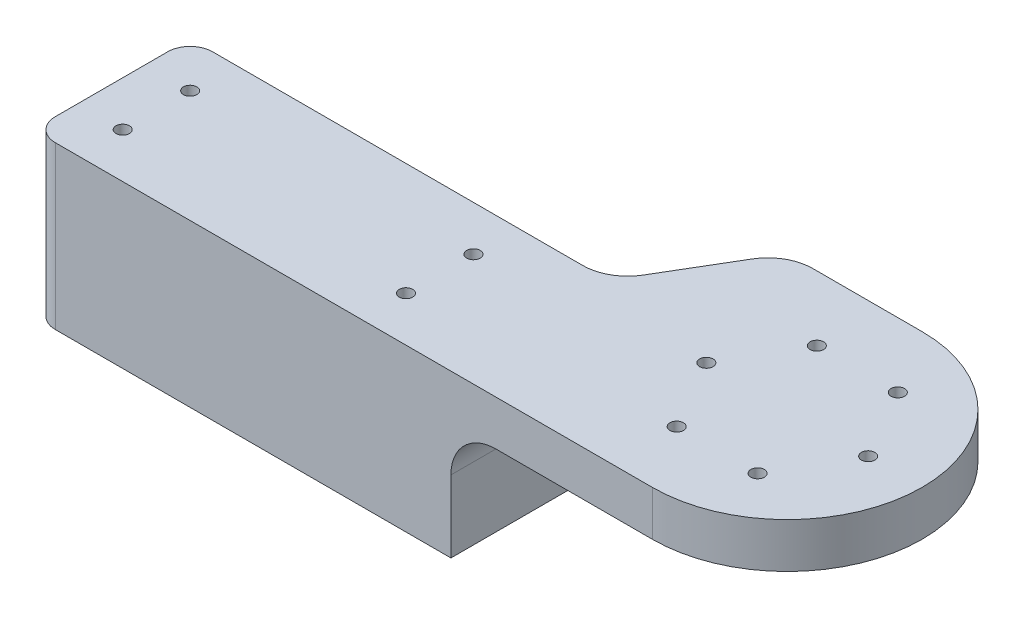
ISO-10303-21;
HEADER;
FILE_DESCRIPTION(('STEP AP214'),'2;1');
FILE_NAME('part.step','',(''),(''),'','','');
FILE_SCHEMA(('AUTOMOTIVE_DESIGN { 1 0 10303 214 1 1 1 1 }'));
ENDSEC;
DATA;
#1=APPLICATION_CONTEXT('core data for automotive mechanical design processes');
#2=APPLICATION_PROTOCOL_DEFINITION('international standard','automotive_design',2000,#1);
#3=PRODUCT_CONTEXT('',#1,'mechanical');
#4=PRODUCT('Part','Part','',(#3));
#5=PRODUCT_RELATED_PRODUCT_CATEGORY('part','',(#4));
#6=PRODUCT_DEFINITION_FORMATION('','',#4);
#7=PRODUCT_DEFINITION_CONTEXT('part definition',#1,'design');
#8=PRODUCT_DEFINITION('design','',#6,#7);
#9=PRODUCT_DEFINITION_SHAPE('','',#8);
#10=(LENGTH_UNIT() NAMED_UNIT(*) SI_UNIT(.MILLI.,.METRE.));
#11=(NAMED_UNIT(*) PLANE_ANGLE_UNIT() SI_UNIT($,.RADIAN.));
#12=(NAMED_UNIT(*) SI_UNIT($,.STERADIAN.) SOLID_ANGLE_UNIT());
#13=UNCERTAINTY_MEASURE_WITH_UNIT(LENGTH_MEASURE(1.E-05),#10,'distance_accuracy_value','');
#14=(GEOMETRIC_REPRESENTATION_CONTEXT(3) GLOBAL_UNCERTAINTY_ASSIGNED_CONTEXT((#13)) GLOBAL_UNIT_ASSIGNED_CONTEXT((#10,
#11,#12)) REPRESENTATION_CONTEXT('',''));
#15=CARTESIAN_POINT('',(0.,0.,0.));
#16=DIRECTION('',(0.,0.,1.));
#17=DIRECTION('',(1.,0.,0.));
#18=AXIS2_PLACEMENT_3D('',#15,#16,#17);
#19=CARTESIAN_POINT('',(0.,10.,35.));
#20=DIRECTION('',(0.,0.,-1.));
#21=DIRECTION('',(-1.,0.,0.));
#22=AXIS2_PLACEMENT_3D('',#19,#20,#21);
#23=PLANE('',#22);
#24=DIRECTION('',(0.,-1.,0.));
#25=VECTOR('',#24,1.);
#26=CARTESIAN_POINT('',(-88.,10.,35.));
#27=LINE('',#26,#25);
#28=CARTESIAN_POINT('',(-88.,10.,35.));
#29=VERTEX_POINT('',#28);
#30=CARTESIAN_POINT('',(-88.,-26.,35.));
#31=VERTEX_POINT('',#30);
#32=EDGE_CURVE('E144',#29,#31,#27,.T.);
#33=ORIENTED_EDGE('',*,*,#32,.T.);
#34=DIRECTION('',(-1.,0.,0.));
#35=VECTOR('',#34,1.);
#36=CARTESIAN_POINT('',(0.,-26.,35.));
#37=LINE('',#36,#35);
#38=CARTESIAN_POINT('',(0.,-26.,35.));
#39=VERTEX_POINT('',#38);
#40=EDGE_CURVE('E147',#39,#31,#37,.T.);
#41=ORIENTED_EDGE('',*,*,#40,.F.);
#42=DIRECTION('',(0.,1.,0.));
#43=VECTOR('',#42,1.);
#44=CARTESIAN_POINT('',(0.,-26.,35.));
#45=LINE('',#44,#43);
#46=CARTESIAN_POINT('',(0.,-10.,35.));
#47=VERTEX_POINT('',#46);
#48=EDGE_CURVE('E181',#39,#47,#45,.T.);
#49=ORIENTED_EDGE('',*,*,#48,.T.);
#50=CARTESIAN_POINT('',(10.,-10.,35.));
#51=DIRECTION('',(0.,0.,-1.));
#52=DIRECTION('',(-1.,0.,0.));
#53=AXIS2_PLACEMENT_3D('',#50,#51,#52);
#54=CIRCLE('',#53,10.);
#55=CARTESIAN_POINT('',(10.,0.,35.));
#56=VERTEX_POINT('',#55);
#57=EDGE_CURVE('E290',#47,#56,#54,.T.);
#58=ORIENTED_EDGE('',*,*,#57,.T.);
#59=DIRECTION('',(1.,0.,0.));
#60=VECTOR('',#59,1.);
#61=CARTESIAN_POINT('',(0.,0.,35.));
#62=LINE('',#61,#60);
#63=CARTESIAN_POINT('',(44.8,0.,35.));
#64=VERTEX_POINT('',#63);
#65=EDGE_CURVE('E249',#56,#64,#62,.T.);
#66=ORIENTED_EDGE('',*,*,#65,.T.);
#67=DIRECTION('',(0.,-1.,0.));
#68=VECTOR('',#67,1.);
#69=CARTESIAN_POINT('',(44.8,10.,35.));
#70=LINE('',#69,#68);
#71=CARTESIAN_POINT('',(44.8,10.,35.));
#72=VERTEX_POINT('',#71);
#73=EDGE_CURVE('E267',#72,#64,#70,.T.);
#74=ORIENTED_EDGE('',*,*,#73,.F.);
#75=DIRECTION('',(1.,0.,0.));
#76=VECTOR('',#75,1.);
#77=CARTESIAN_POINT('',(0.,10.,35.));
#78=LINE('',#77,#76);
#79=EDGE_CURVE('E150',#29,#72,#78,.T.);
#80=ORIENTED_EDGE('',*,*,#79,.F.);
#81=EDGE_LOOP('',(#33,#41,#49,#58,#66,#74,#80));
#82=FACE_BOUND('',#81,.T.);
#83=ADVANCED_FACE('F43',(#82),#23,.F.);
#84=CARTESIAN_POINT('',(44.8,10.,5.));
#85=DIRECTION('',(0.,-1.,0.));
#86=DIRECTION('',(0.,0.,-1.));
#87=AXIS2_PLACEMENT_3D('',#84,#85,#86);
#88=CYLINDRICAL_SURFACE('',#87,30.);
#89=CARTESIAN_POINT('',(44.8,0.,5.));
#90=DIRECTION('',(0.,1.,0.));
#91=DIRECTION('',(0.,0.,1.));
#92=AXIS2_PLACEMENT_3D('',#89,#90,#91);
#93=CIRCLE('',#92,30.);
#94=CARTESIAN_POINT('',(44.8,0.,-25.));
#95=VERTEX_POINT('',#94);
#96=EDGE_CURVE('E251',#64,#95,#93,.T.);
#97=ORIENTED_EDGE('',*,*,#96,.T.);
#98=DIRECTION('',(0.,-1.,0.));
#99=VECTOR('',#98,1.);
#100=CARTESIAN_POINT('',(44.8,10.,-25.));
#101=LINE('',#100,#99);
#102=CARTESIAN_POINT('',(44.8,10.,-25.));
#103=VERTEX_POINT('',#102);
#104=EDGE_CURVE('E264',#103,#95,#101,.T.);
#105=ORIENTED_EDGE('',*,*,#104,.F.);
#106=CARTESIAN_POINT('',(44.8,10.,5.));
#107=DIRECTION('',(0.,1.,0.));
#108=DIRECTION('',(0.,0.,1.));
#109=AXIS2_PLACEMENT_3D('',#106,#107,#108);
#110=CIRCLE('',#109,30.);
#111=EDGE_CURVE('E204',#72,#103,#110,.T.);
#112=ORIENTED_EDGE('',*,*,#111,.F.);
#113=ORIENTED_EDGE('',*,*,#73,.T.);
#114=EDGE_LOOP('',(#97,#105,#112,#113));
#115=FACE_BOUND('',#114,.T.);
#116=ADVANCED_FACE('F332',(#115),#88,.T.);
#117=CARTESIAN_POINT('',(0.,10.,-25.));
#118=DIRECTION('',(0.,0.,1.));
#119=DIRECTION('',(1.,0.,0.));
#120=AXIS2_PLACEMENT_3D('',#117,#118,#119);
#121=PLANE('',#120);
#122=DIRECTION('',(-1.,0.,0.));
#123=VECTOR('',#122,1.);
#124=CARTESIAN_POINT('',(0.,0.,-25.));
#125=LINE('',#124,#123);
#126=CARTESIAN_POINT('',(20.5009466051609,0.,-25.));
#127=VERTEX_POINT('',#126);
#128=EDGE_CURVE('E253',#95,#127,#125,.T.);
#129=ORIENTED_EDGE('',*,*,#128,.T.);
#130=DIRECTION('',(0.,-1.,0.));
#131=VECTOR('',#130,1.);
#132=CARTESIAN_POINT('',(20.5009466051609,10.,-25.));
#133=LINE('',#132,#131);
#134=CARTESIAN_POINT('',(20.5009466051609,10.,-25.));
#135=VERTEX_POINT('',#134);
#136=EDGE_CURVE('E283',#127,#135,#133,.F.);
#137=ORIENTED_EDGE('',*,*,#136,.T.);
#138=DIRECTION('',(-1.,0.,0.));
#139=VECTOR('',#138,1.);
#140=CARTESIAN_POINT('',(0.,10.,-25.));
#141=LINE('',#140,#139);
#142=EDGE_CURVE('E206',#103,#135,#141,.T.);
#143=ORIENTED_EDGE('',*,*,#142,.F.);
#144=ORIENTED_EDGE('',*,*,#104,.T.);
#145=EDGE_LOOP('',(#129,#137,#143,#144));
#146=FACE_BOUND('',#145,.T.);
#147=ADVANCED_FACE('F339',(#146),#121,.F.);
#148=CARTESIAN_POINT('',(0.,10.,0.));
#149=DIRECTION('',(0.860515097415472,0.,0.509424937669959));
#150=DIRECTION('',(0.509424937669959,0.,-0.860515097415472));
#151=AXIS2_PLACEMENT_3D('',#148,#149,#150);
#152=PLANE('',#151);
#153=CARTESIAN_POINT('',(10.,-10.,-16.8918918918919));
#154=DIRECTION('',(0.860515097415472,0.,0.509424937669959));
#155=DIRECTION('',(0.509424937669959,0.,-0.860515097415472));
#156=AXIS2_PLACEMENT_3D('',#153,#154,#155);
#157=ELLIPSE('',#156,19.6299773735826,10.);
#158=CARTESIAN_POINT('',(10.,0.,-16.8918918918919));
#159=VERTEX_POINT('',#158);
#160=CARTESIAN_POINT('',(2.90420436899384,-2.9537467854899,-4.90575062330041));
#161=VERTEX_POINT('',#160);
#162=EDGE_CURVE('E287',#159,#161,#157,.T.);
#163=ORIENTED_EDGE('',*,*,#162,.T.);
#164=DIRECTION('',(0.,-1.,0.));
#165=VECTOR('',#164,1.);
#166=CARTESIAN_POINT('',(2.90420436899384,10.,-4.90575062330041));
#167=LINE('',#166,#165);
#168=CARTESIAN_POINT('',(2.90420436899384,10.,-4.90575062330041));
#169=VERTEX_POINT('',#168);
#170=EDGE_CURVE('E281',#161,#169,#167,.F.);
#171=ORIENTED_EDGE('',*,*,#170,.T.);
#172=DIRECTION('',(-0.509424937669959,0.,0.860515097415472));
#173=VECTOR('',#172,1.);
#174=CARTESIAN_POINT('',(0.,10.,0.));
#175=LINE('',#174,#173);
#176=CARTESIAN_POINT('',(11.8957956310062,10.,-20.0942493766996));
#177=VERTEX_POINT('',#176);
#178=EDGE_CURVE('E209',#177,#169,#175,.T.);
#179=ORIENTED_EDGE('',*,*,#178,.F.);
#180=DIRECTION('',(0.,-1.,0.));
#181=VECTOR('',#180,1.);
#182=CARTESIAN_POINT('',(11.8957956310062,10.,-20.0942493766996));
#183=LINE('',#182,#181);
#184=CARTESIAN_POINT('',(11.8957956310062,0.,-20.0942493766996));
#185=VERTEX_POINT('',#184);
#186=EDGE_CURVE('E278',#177,#185,#183,.T.);
#187=ORIENTED_EDGE('',*,*,#186,.T.);
#188=DIRECTION('',(-0.509424937669959,0.,0.860515097415472));
#189=VECTOR('',#188,1.);
#190=CARTESIAN_POINT('',(0.,0.,0.));
#191=LINE('',#190,#189);
#192=EDGE_CURVE('E188',#185,#159,#191,.T.);
#193=ORIENTED_EDGE('',*,*,#192,.T.);
#194=EDGE_LOOP('',(#163,#171,#179,#187,#193));
#195=FACE_BOUND('',#194,.T.);
#196=ADVANCED_FACE('F404',(#195),#152,.F.);
#197=CARTESIAN_POINT('',(0.,10.,0.));
#198=DIRECTION('',(0.,0.,1.));
#199=DIRECTION('',(1.,0.,0.));
#200=AXIS2_PLACEMENT_3D('',#197,#198,#199);
#201=PLANE('',#200);
#202=DIRECTION('',(-1.,0.,0.));
#203=VECTOR('',#202,1.);
#204=CARTESIAN_POINT('',(0.,10.,0.));
#205=LINE('',#204,#203);
#206=CARTESIAN_POINT('',(-5.70094660516087,10.,0.));
#207=VERTEX_POINT('',#206);
#208=CARTESIAN_POINT('',(-88.,10.,0.));
#209=VERTEX_POINT('',#208);
#210=EDGE_CURVE('E212',#207,#209,#205,.T.);
#211=ORIENTED_EDGE('',*,*,#210,.F.);
#212=DIRECTION('',(0.,-1.,0.));
#213=VECTOR('',#212,1.);
#214=CARTESIAN_POINT('',(-5.70094660516087,0.,0.));
#215=LINE('',#214,#213);
#216=CARTESIAN_POINT('',(-5.70094660516087,-26.,0.));
#217=VERTEX_POINT('',#216);
#218=EDGE_CURVE('E276',#207,#217,#215,.T.);
#219=ORIENTED_EDGE('',*,*,#218,.T.);
#220=DIRECTION('',(-1.,0.,0.));
#221=VECTOR('',#220,1.);
#222=CARTESIAN_POINT('',(0.,-26.,0.));
#223=LINE('',#222,#221);
#224=CARTESIAN_POINT('',(-88.,-26.,0.));
#225=VERTEX_POINT('',#224);
#226=EDGE_CURVE('E174',#217,#225,#223,.T.);
#227=ORIENTED_EDGE('',*,*,#226,.T.);
#228=DIRECTION('',(0.,-1.,0.));
#229=VECTOR('',#228,1.);
#230=CARTESIAN_POINT('',(-88.,10.,0.));
#231=LINE('',#230,#229);
#232=EDGE_CURVE('E261',#209,#225,#231,.T.);
#233=ORIENTED_EDGE('',*,*,#232,.F.);
#234=EDGE_LOOP('',(#211,#219,#227,#233));
#235=FACE_BOUND('',#234,.T.);
#236=ADVANCED_FACE('F398',(#235),#201,.F.);
#237=CARTESIAN_POINT('',(-88.,10.,5.));
#238=DIRECTION('',(0.,-1.,0.));
#239=DIRECTION('',(0.,0.,-1.));
#240=AXIS2_PLACEMENT_3D('',#237,#238,#239);
#241=CYLINDRICAL_SURFACE('',#240,5.);
#242=ORIENTED_EDGE('',*,*,#232,.T.);
#243=CARTESIAN_POINT('',(-88.,-26.,5.));
#244=DIRECTION('',(0.,1.,0.));
#245=DIRECTION('',(0.,0.,1.));
#246=AXIS2_PLACEMENT_3D('',#243,#244,#245);
#247=CIRCLE('',#246,5.);
#248=CARTESIAN_POINT('',(-93.,-26.,5.00000000000004));
#249=VERTEX_POINT('',#248);
#250=EDGE_CURVE('E176',#225,#249,#247,.T.);
#251=ORIENTED_EDGE('',*,*,#250,.T.);
#252=DIRECTION('',(0.,-1.,0.));
#253=VECTOR('',#252,1.);
#254=CARTESIAN_POINT('',(-93.,10.,5.00000000000004));
#255=LINE('',#254,#253);
#256=CARTESIAN_POINT('',(-93.,10.,5.00000000000004));
#257=VERTEX_POINT('',#256);
#258=EDGE_CURVE('E259',#257,#249,#255,.T.);
#259=ORIENTED_EDGE('',*,*,#258,.F.);
#260=CARTESIAN_POINT('',(-88.,10.,5.));
#261=DIRECTION('',(0.,1.,0.));
#262=DIRECTION('',(0.,0.,1.));
#263=AXIS2_PLACEMENT_3D('',#260,#261,#262);
#264=CIRCLE('',#263,5.);
#265=EDGE_CURVE('E214',#209,#257,#264,.T.);
#266=ORIENTED_EDGE('',*,*,#265,.F.);
#267=EDGE_LOOP('',(#242,#251,#259,#266));
#268=FACE_BOUND('',#267,.T.);
#269=ADVANCED_FACE('F327',(#268),#241,.T.);
#270=CARTESIAN_POINT('',(-93.,10.,0.));
#271=DIRECTION('',(-1.,0.,0.));
#272=DIRECTION('',(0.,0.,1.));
#273=AXIS2_PLACEMENT_3D('',#270,#271,#272);
#274=PLANE('',#273);
#275=ORIENTED_EDGE('',*,*,#258,.T.);
#276=DIRECTION('',(0.,0.,-1.));
#277=VECTOR('',#276,1.);
#278=CARTESIAN_POINT('',(-93.,-26.,0.));
#279=LINE('',#278,#277);
#280=CARTESIAN_POINT('',(-93.,-26.,30.));
#281=VERTEX_POINT('',#280);
#282=EDGE_CURVE('E179',#281,#249,#279,.T.);
#283=ORIENTED_EDGE('',*,*,#282,.F.);
#284=DIRECTION('',(0.,-1.,0.));
#285=VECTOR('',#284,1.);
#286=CARTESIAN_POINT('',(-93.,10.,30.));
#287=LINE('',#286,#285);
#288=CARTESIAN_POINT('',(-93.,10.,30.));
#289=VERTEX_POINT('',#288);
#290=EDGE_CURVE('E155',#289,#281,#287,.T.);
#291=ORIENTED_EDGE('',*,*,#290,.F.);
#292=DIRECTION('',(0.,0.,-1.));
#293=VECTOR('',#292,1.);
#294=CARTESIAN_POINT('',(-93.,10.,0.));
#295=LINE('',#294,#293);
#296=EDGE_CURVE('E216',#289,#257,#295,.T.);
#297=ORIENTED_EDGE('',*,*,#296,.T.);
#298=EDGE_LOOP('',(#275,#283,#291,#297));
#299=FACE_BOUND('',#298,.T.);
#300=ADVANCED_FACE('F317',(#299),#274,.T.);
#301=CARTESIAN_POINT('',(-83.,10.,25.));
#302=DIRECTION('',(0.,-1.,0.));
#303=DIRECTION('',(0.,0.,-1.));
#304=AXIS2_PLACEMENT_3D('',#301,#302,#303);
#305=CYLINDRICAL_SURFACE('',#304,1.5);
#306=CARTESIAN_POINT('',(-83.,10.,25.));
#307=DIRECTION('',(0.,1.,0.));
#308=DIRECTION('',(0.,0.,1.));
#309=AXIS2_PLACEMENT_3D('',#306,#307,#308);
#310=CIRCLE('',#309,1.5);
#311=CARTESIAN_POINT('',(-83.,10.,26.5));
#312=VERTEX_POINT('',#311);
#313=EDGE_CURVE('E227',#312,#312,#310,.T.);
#314=ORIENTED_EDGE('',*,*,#313,.T.);
#315=EDGE_LOOP('',(#314));
#316=FACE_BOUND('',#315,.T.);
#317=CARTESIAN_POINT('',(-83.,-26.,25.));
#318=DIRECTION('',(0.,1.,0.));
#319=DIRECTION('',(0.,0.,1.));
#320=AXIS2_PLACEMENT_3D('',#317,#318,#319);
#321=CIRCLE('',#320,1.5);
#322=CARTESIAN_POINT('',(-83.,-26.,26.5));
#323=VERTEX_POINT('',#322);
#324=EDGE_CURVE('E169',#323,#323,#321,.T.);
#325=ORIENTED_EDGE('',*,*,#324,.F.);
#326=EDGE_LOOP('',(#325));
#327=FACE_BOUND('',#326,.T.);
#328=ADVANCED_FACE('F314',(#316,#327),#305,.F.);
#329=CARTESIAN_POINT('',(-83.,10.,10.));
#330=DIRECTION('',(0.,-1.,0.));
#331=DIRECTION('',(0.,0.,-1.));
#332=AXIS2_PLACEMENT_3D('',#329,#330,#331);
#333=CYLINDRICAL_SURFACE('',#332,1.5);
#334=CARTESIAN_POINT('',(-83.,10.,10.));
#335=DIRECTION('',(0.,1.,0.));
#336=DIRECTION('',(0.,0.,1.));
#337=AXIS2_PLACEMENT_3D('',#334,#335,#336);
#338=CIRCLE('',#337,1.5);
#339=CARTESIAN_POINT('',(-83.,10.,11.5));
#340=VERTEX_POINT('',#339);
#341=EDGE_CURVE('E224',#340,#340,#338,.T.);
#342=ORIENTED_EDGE('',*,*,#341,.T.);
#343=EDGE_LOOP('',(#342));
#344=FACE_BOUND('',#343,.T.);
#345=CARTESIAN_POINT('',(-83.,-26.,10.));
#346=DIRECTION('',(0.,1.,0.));
#347=DIRECTION('',(0.,0.,1.));
#348=AXIS2_PLACEMENT_3D('',#345,#346,#347);
#349=CIRCLE('',#348,1.5);
#350=CARTESIAN_POINT('',(-83.,-26.,11.5));
#351=VERTEX_POINT('',#350);
#352=EDGE_CURVE('E303',#351,#351,#349,.T.);
#353=ORIENTED_EDGE('',*,*,#352,.F.);
#354=EDGE_LOOP('',(#353));
#355=FACE_BOUND('',#354,.T.);
#356=ADVANCED_FACE('F316',(#344,#355),#333,.F.);
#357=CARTESIAN_POINT('',(-20.,10.,10.));
#358=DIRECTION('',(0.,-1.,0.));
#359=DIRECTION('',(0.,0.,-1.));
#360=AXIS2_PLACEMENT_3D('',#357,#358,#359);
#361=CYLINDRICAL_SURFACE('',#360,1.5);
#362=CARTESIAN_POINT('',(-20.,10.,10.));
#363=DIRECTION('',(0.,1.,0.));
#364=DIRECTION('',(0.,0.,1.));
#365=AXIS2_PLACEMENT_3D('',#362,#363,#364);
#366=CIRCLE('',#365,1.5);
#367=CARTESIAN_POINT('',(-20.,10.,11.5));
#368=VERTEX_POINT('',#367);
#369=EDGE_CURVE('E221',#368,#368,#366,.T.);
#370=ORIENTED_EDGE('',*,*,#369,.T.);
#371=EDGE_LOOP('',(#370));
#372=FACE_BOUND('',#371,.T.);
#373=CARTESIAN_POINT('',(-20.,-26.,10.));
#374=DIRECTION('',(0.,1.,0.));
#375=DIRECTION('',(0.,0.,1.));
#376=AXIS2_PLACEMENT_3D('',#373,#374,#375);
#377=CIRCLE('',#376,1.5);
#378=CARTESIAN_POINT('',(-20.,-26.,11.5));
#379=VERTEX_POINT('',#378);
#380=EDGE_CURVE('E301',#379,#379,#377,.T.);
#381=ORIENTED_EDGE('',*,*,#380,.F.);
#382=EDGE_LOOP('',(#381));
#383=FACE_BOUND('',#382,.T.);
#384=ADVANCED_FACE('F324',(#372,#383),#361,.F.);
#385=CARTESIAN_POINT('',(-88.,10.,30.));
#386=DIRECTION('',(0.,-1.,0.));
#387=DIRECTION('',(0.,0.,-1.));
#388=AXIS2_PLACEMENT_3D('',#385,#386,#387);
#389=CYLINDRICAL_SURFACE('',#388,5.);
#390=ORIENTED_EDGE('',*,*,#290,.T.);
#391=CARTESIAN_POINT('',(-88.,-26.,30.));
#392=DIRECTION('',(0.,1.,0.));
#393=DIRECTION('',(0.,0.,1.));
#394=AXIS2_PLACEMENT_3D('',#391,#392,#393);
#395=CIRCLE('',#394,5.);
#396=EDGE_CURVE('E162',#31,#281,#395,.F.);
#397=ORIENTED_EDGE('',*,*,#396,.F.);
#398=ORIENTED_EDGE('',*,*,#32,.F.);
#399=CARTESIAN_POINT('',(-88.,10.,30.));
#400=DIRECTION('',(0.,1.,0.));
#401=DIRECTION('',(0.,0.,1.));
#402=AXIS2_PLACEMENT_3D('',#399,#400,#401);
#403=CIRCLE('',#402,5.);
#404=EDGE_CURVE('E219',#29,#289,#403,.F.);
#405=ORIENTED_EDGE('',*,*,#404,.T.);
#406=EDGE_LOOP('',(#390,#397,#398,#405));
#407=FACE_BOUND('',#406,.T.);
#408=ADVANCED_FACE('F164',(#407),#389,.T.);
#409=CARTESIAN_POINT('',(62.8,10.,5.));
#410=DIRECTION('',(0.,-1.,0.));
#411=DIRECTION('',(0.,0.,-1.));
#412=AXIS2_PLACEMENT_3D('',#409,#410,#411);
#413=CYLINDRICAL_SURFACE('',#412,1.5);
#414=CARTESIAN_POINT('',(62.8,10.,5.));
#415=DIRECTION('',(0.,1.,0.));
#416=DIRECTION('',(0.,0.,1.));
#417=AXIS2_PLACEMENT_3D('',#414,#415,#416);
#418=CIRCLE('',#417,1.5);
#419=CARTESIAN_POINT('',(62.8,10.,6.50000000000001));
#420=VERTEX_POINT('',#419);
#421=EDGE_CURVE('E200',#420,#420,#418,.T.);
#422=ORIENTED_EDGE('',*,*,#421,.T.);
#423=EDGE_LOOP('',(#422));
#424=FACE_BOUND('',#423,.T.);
#425=CARTESIAN_POINT('',(62.8,0.,5.));
#426=DIRECTION('',(0.,1.,0.));
#427=DIRECTION('',(0.,0.,1.));
#428=AXIS2_PLACEMENT_3D('',#425,#426,#427);
#429=CIRCLE('',#428,1.5);
#430=CARTESIAN_POINT('',(62.8,0.,6.50000000000001));
#431=VERTEX_POINT('',#430);
#432=EDGE_CURVE('E246',#431,#431,#429,.T.);
#433=ORIENTED_EDGE('',*,*,#432,.F.);
#434=EDGE_LOOP('',(#433));
#435=FACE_BOUND('',#434,.T.);
#436=ADVANCED_FACE('F344',(#424,#435),#413,.F.);
#437=CARTESIAN_POINT('',(53.8,10.,20.5884572681199));
#438=DIRECTION('',(0.,-1.,0.));
#439=DIRECTION('',(0.,0.,-1.));
#440=AXIS2_PLACEMENT_3D('',#437,#438,#439);
#441=CYLINDRICAL_SURFACE('',#440,1.50000000000001);
#442=CARTESIAN_POINT('',(53.8,10.,20.5884572681199));
#443=DIRECTION('',(0.,1.,0.));
#444=DIRECTION('',(0.,0.,1.));
#445=AXIS2_PLACEMENT_3D('',#442,#443,#444);
#446=CIRCLE('',#445,1.50000000000001);
#447=CARTESIAN_POINT('',(53.8,10.,22.0884572681199));
#448=VERTEX_POINT('',#447);
#449=EDGE_CURVE('E197',#448,#448,#446,.T.);
#450=ORIENTED_EDGE('',*,*,#449,.T.);
#451=EDGE_LOOP('',(#450));
#452=FACE_BOUND('',#451,.T.);
#453=CARTESIAN_POINT('',(53.8,0.,20.5884572681199));
#454=DIRECTION('',(0.,1.,0.));
#455=DIRECTION('',(0.,0.,1.));
#456=AXIS2_PLACEMENT_3D('',#453,#454,#455);
#457=CIRCLE('',#456,1.50000000000001);
#458=CARTESIAN_POINT('',(53.8,0.,22.0884572681199));
#459=VERTEX_POINT('',#458);
#460=EDGE_CURVE('E243',#459,#459,#457,.T.);
#461=ORIENTED_EDGE('',*,*,#460,.F.);
#462=EDGE_LOOP('',(#461));
#463=FACE_BOUND('',#462,.T.);
#464=ADVANCED_FACE('F347',(#452,#463),#441,.F.);
#465=CARTESIAN_POINT('',(35.8,10.,20.5884572681199));
#466=DIRECTION('',(0.,-1.,0.));
#467=DIRECTION('',(0.,0.,-1.));
#468=AXIS2_PLACEMENT_3D('',#465,#466,#467);
#469=CYLINDRICAL_SURFACE('',#468,1.50000000000001);
#470=CARTESIAN_POINT('',(35.8,10.,20.5884572681199));
#471=DIRECTION('',(0.,1.,0.));
#472=DIRECTION('',(0.,0.,1.));
#473=AXIS2_PLACEMENT_3D('',#470,#471,#472);
#474=CIRCLE('',#473,1.50000000000001);
#475=CARTESIAN_POINT('',(35.8,10.,22.0884572681199));
#476=VERTEX_POINT('',#475);
#477=EDGE_CURVE('E194',#476,#476,#474,.T.);
#478=ORIENTED_EDGE('',*,*,#477,.T.);
#479=EDGE_LOOP('',(#478));
#480=FACE_BOUND('',#479,.T.);
#481=CARTESIAN_POINT('',(35.8,0.,20.5884572681199));
#482=DIRECTION('',(0.,1.,0.));
#483=DIRECTION('',(0.,0.,1.));
#484=AXIS2_PLACEMENT_3D('',#481,#482,#483);
#485=CIRCLE('',#484,1.50000000000001);
#486=CARTESIAN_POINT('',(35.8,0.,22.0884572681199));
#487=VERTEX_POINT('',#486);
#488=EDGE_CURVE('E240',#487,#487,#485,.T.);
#489=ORIENTED_EDGE('',*,*,#488,.F.);
#490=EDGE_LOOP('',(#489));
#491=FACE_BOUND('',#490,.T.);
#492=ADVANCED_FACE('F351',(#480,#491),#469,.F.);
#493=CARTESIAN_POINT('',(26.8,10.,5.));
#494=DIRECTION('',(0.,-1.,0.));
#495=DIRECTION('',(0.,0.,-1.));
#496=AXIS2_PLACEMENT_3D('',#493,#494,#495);
#497=CYLINDRICAL_SURFACE('',#496,1.5);
#498=CARTESIAN_POINT('',(26.8,10.,5.));
#499=DIRECTION('',(0.,1.,0.));
#500=DIRECTION('',(0.,0.,1.));
#501=AXIS2_PLACEMENT_3D('',#498,#499,#500);
#502=CIRCLE('',#501,1.5);
#503=CARTESIAN_POINT('',(26.8,10.,6.50000000000001));
#504=VERTEX_POINT('',#503);
#505=EDGE_CURVE('E191',#504,#504,#502,.T.);
#506=ORIENTED_EDGE('',*,*,#505,.T.);
#507=EDGE_LOOP('',(#506));
#508=FACE_BOUND('',#507,.T.);
#509=CARTESIAN_POINT('',(26.8,0.,5.));
#510=DIRECTION('',(0.,1.,0.));
#511=DIRECTION('',(0.,0.,1.));
#512=AXIS2_PLACEMENT_3D('',#509,#510,#511);
#513=CIRCLE('',#512,1.5);
#514=CARTESIAN_POINT('',(26.8,0.,6.50000000000001));
#515=VERTEX_POINT('',#514);
#516=EDGE_CURVE('E237',#515,#515,#513,.T.);
#517=ORIENTED_EDGE('',*,*,#516,.F.);
#518=EDGE_LOOP('',(#517));
#519=FACE_BOUND('',#518,.T.);
#520=ADVANCED_FACE('F355',(#508,#519),#497,.F.);
#521=CARTESIAN_POINT('',(35.8,10.,-10.5884572681199));
#522=DIRECTION('',(0.,-1.,0.));
#523=DIRECTION('',(0.,0.,-1.));
#524=AXIS2_PLACEMENT_3D('',#521,#522,#523);
#525=CYLINDRICAL_SURFACE('',#524,1.50000000000001);
#526=CARTESIAN_POINT('',(35.8,10.,-10.5884572681199));
#527=DIRECTION('',(0.,1.,0.));
#528=DIRECTION('',(0.,0.,1.));
#529=AXIS2_PLACEMENT_3D('',#526,#527,#528);
#530=CIRCLE('',#529,1.50000000000001);
#531=CARTESIAN_POINT('',(35.8,10.,-9.08845726811988));
#532=VERTEX_POINT('',#531);
#533=EDGE_CURVE('E187',#532,#532,#530,.T.);
#534=ORIENTED_EDGE('',*,*,#533,.T.);
#535=EDGE_LOOP('',(#534));
#536=FACE_BOUND('',#535,.T.);
#537=CARTESIAN_POINT('',(35.8,0.,-10.5884572681199));
#538=DIRECTION('',(0.,1.,0.));
#539=DIRECTION('',(0.,0.,1.));
#540=AXIS2_PLACEMENT_3D('',#537,#538,#539);
#541=CIRCLE('',#540,1.50000000000001);
#542=CARTESIAN_POINT('',(35.8,0.,-9.08845726811988));
#543=VERTEX_POINT('',#542);
#544=EDGE_CURVE('E234',#543,#543,#541,.T.);
#545=ORIENTED_EDGE('',*,*,#544,.F.);
#546=EDGE_LOOP('',(#545));
#547=FACE_BOUND('',#546,.T.);
#548=ADVANCED_FACE('F359',(#536,#547),#525,.F.);
#549=CARTESIAN_POINT('',(53.8,10.,-10.5884572681199));
#550=DIRECTION('',(0.,-1.,0.));
#551=DIRECTION('',(0.,0.,-1.));
#552=AXIS2_PLACEMENT_3D('',#549,#550,#551);
#553=CYLINDRICAL_SURFACE('',#552,1.5);
#554=CARTESIAN_POINT('',(53.8,10.,-10.5884572681199));
#555=DIRECTION('',(0.,1.,0.));
#556=DIRECTION('',(0.,0.,1.));
#557=AXIS2_PLACEMENT_3D('',#554,#555,#556);
#558=CIRCLE('',#557,1.5);
#559=CARTESIAN_POINT('',(53.8,10.,-9.08845726811991));
#560=VERTEX_POINT('',#559);
#561=EDGE_CURVE('E184',#560,#560,#558,.T.);
#562=ORIENTED_EDGE('',*,*,#561,.T.);
#563=EDGE_LOOP('',(#562));
#564=FACE_BOUND('',#563,.T.);
#565=CARTESIAN_POINT('',(53.8,0.,-10.5884572681199));
#566=DIRECTION('',(0.,1.,0.));
#567=DIRECTION('',(0.,0.,1.));
#568=AXIS2_PLACEMENT_3D('',#565,#566,#567);
#569=CIRCLE('',#568,1.5);
#570=CARTESIAN_POINT('',(53.8,0.,-9.08845726811991));
#571=VERTEX_POINT('',#570);
#572=EDGE_CURVE('E183',#571,#571,#569,.T.);
#573=ORIENTED_EDGE('',*,*,#572,.F.);
#574=EDGE_LOOP('',(#573));
#575=FACE_BOUND('',#574,.T.);
#576=ADVANCED_FACE('F363',(#564,#575),#553,.F.);
#577=CARTESIAN_POINT('',(-20.,10.,25.));
#578=DIRECTION('',(0.,-1.,0.));
#579=DIRECTION('',(0.,0.,-1.));
#580=AXIS2_PLACEMENT_3D('',#577,#578,#579);
#581=CYLINDRICAL_SURFACE('',#580,1.5);
#582=CARTESIAN_POINT('',(-20.,10.,25.));
#583=DIRECTION('',(0.,1.,0.));
#584=DIRECTION('',(0.,0.,1.));
#585=AXIS2_PLACEMENT_3D('',#582,#583,#584);
#586=CIRCLE('',#585,1.5);
#587=CARTESIAN_POINT('',(-20.,10.,26.5));
#588=VERTEX_POINT('',#587);
#589=EDGE_CURVE('E156',#588,#588,#586,.T.);
#590=ORIENTED_EDGE('',*,*,#589,.T.);
#591=EDGE_LOOP('',(#590));
#592=FACE_BOUND('',#591,.T.);
#593=CARTESIAN_POINT('',(-20.,-26.,25.));
#594=DIRECTION('',(0.,1.,0.));
#595=DIRECTION('',(0.,0.,1.));
#596=AXIS2_PLACEMENT_3D('',#593,#594,#595);
#597=CIRCLE('',#596,1.5);
#598=CARTESIAN_POINT('',(-20.,-26.,26.5));
#599=VERTEX_POINT('',#598);
#600=EDGE_CURVE('E166',#599,#599,#597,.T.);
#601=ORIENTED_EDGE('',*,*,#600,.F.);
#602=EDGE_LOOP('',(#601));
#603=FACE_BOUND('',#602,.T.);
#604=ADVANCED_FACE('F366',(#592,#603),#581,.F.);
#605=CARTESIAN_POINT('',(0.,10.,0.));
#606=DIRECTION('',(0.,1.,0.));
#607=DIRECTION('',(0.,0.,1.));
#608=AXIS2_PLACEMENT_3D('',#605,#606,#607);
#609=PLANE('',#608);
#610=ORIENTED_EDGE('',*,*,#561,.F.);
#611=EDGE_LOOP('',(#610));
#612=FACE_BOUND('',#611,.T.);
#613=ORIENTED_EDGE('',*,*,#533,.F.);
#614=EDGE_LOOP('',(#613));
#615=FACE_BOUND('',#614,.T.);
#616=ORIENTED_EDGE('',*,*,#505,.F.);
#617=EDGE_LOOP('',(#616));
#618=FACE_BOUND('',#617,.T.);
#619=ORIENTED_EDGE('',*,*,#477,.F.);
#620=EDGE_LOOP('',(#619));
#621=FACE_BOUND('',#620,.T.);
#622=ORIENTED_EDGE('',*,*,#449,.F.);
#623=EDGE_LOOP('',(#622));
#624=FACE_BOUND('',#623,.T.);
#625=ORIENTED_EDGE('',*,*,#421,.F.);
#626=EDGE_LOOP('',(#625));
#627=FACE_BOUND('',#626,.T.);
#628=ORIENTED_EDGE('',*,*,#142,.T.);
#629=CARTESIAN_POINT('',(20.5009466051609,10.,-15.));
#630=DIRECTION('',(0.,1.,0.));
#631=DIRECTION('',(0.,0.,1.));
#632=AXIS2_PLACEMENT_3D('',#629,#630,#631);
#633=CIRCLE('',#632,10.);
#634=EDGE_CURVE('E285',#135,#177,#633,.T.);
#635=ORIENTED_EDGE('',*,*,#634,.T.);
#636=ORIENTED_EDGE('',*,*,#178,.T.);
#637=CARTESIAN_POINT('',(-5.70094660516087,10.,-10.));
#638=DIRECTION('',(0.,1.,0.));
#639=DIRECTION('',(0.,0.,1.));
#640=AXIS2_PLACEMENT_3D('',#637,#638,#639);
#641=CIRCLE('',#640,10.);
#642=EDGE_CURVE('E11',#169,#207,#641,.F.);
#643=ORIENTED_EDGE('',*,*,#642,.T.);
#644=ORIENTED_EDGE('',*,*,#210,.T.);
#645=ORIENTED_EDGE('',*,*,#265,.T.);
#646=ORIENTED_EDGE('',*,*,#296,.F.);
#647=ORIENTED_EDGE('',*,*,#404,.F.);
#648=ORIENTED_EDGE('',*,*,#79,.T.);
#649=ORIENTED_EDGE('',*,*,#111,.T.);
#650=EDGE_LOOP('',(#628,#635,#636,#643,#644,#645,#646,#647,#648,#649));
#651=FACE_BOUND('',#650,.T.);
#652=ORIENTED_EDGE('',*,*,#369,.F.);
#653=EDGE_LOOP('',(#652));
#654=FACE_BOUND('',#653,.T.);
#655=ORIENTED_EDGE('',*,*,#341,.F.);
#656=EDGE_LOOP('',(#655));
#657=FACE_BOUND('',#656,.T.);
#658=ORIENTED_EDGE('',*,*,#313,.F.);
#659=EDGE_LOOP('',(#658));
#660=FACE_BOUND('',#659,.T.);
#661=ORIENTED_EDGE('',*,*,#589,.F.);
#662=EDGE_LOOP('',(#661));
#663=FACE_BOUND('',#662,.T.);
#664=ADVANCED_FACE('F387',(#612,#615,#618,#621,#624,#627,#651,#654,#657,#660,#663),#609,.T.);
#665=CARTESIAN_POINT('',(0.,0.,0.));
#666=DIRECTION('',(0.,1.,0.));
#667=DIRECTION('',(0.,0.,1.));
#668=AXIS2_PLACEMENT_3D('',#665,#666,#667);
#669=PLANE('',#668);
#670=ORIENTED_EDGE('',*,*,#572,.T.);
#671=EDGE_LOOP('',(#670));
#672=FACE_BOUND('',#671,.T.);
#673=ORIENTED_EDGE('',*,*,#544,.T.);
#674=EDGE_LOOP('',(#673));
#675=FACE_BOUND('',#674,.T.);
#676=ORIENTED_EDGE('',*,*,#516,.T.);
#677=EDGE_LOOP('',(#676));
#678=FACE_BOUND('',#677,.T.);
#679=ORIENTED_EDGE('',*,*,#488,.T.);
#680=EDGE_LOOP('',(#679));
#681=FACE_BOUND('',#680,.T.);
#682=ORIENTED_EDGE('',*,*,#460,.T.);
#683=EDGE_LOOP('',(#682));
#684=FACE_BOUND('',#683,.T.);
#685=ORIENTED_EDGE('',*,*,#432,.T.);
#686=EDGE_LOOP('',(#685));
#687=FACE_BOUND('',#686,.T.);
#688=ORIENTED_EDGE('',*,*,#65,.F.);
#689=DIRECTION('',(0.,0.,-1.));
#690=VECTOR('',#689,1.);
#691=CARTESIAN_POINT('',(10.,0.,0.));
#692=LINE('',#691,#690);
#693=EDGE_CURVE('E272',#56,#159,#692,.T.);
#694=ORIENTED_EDGE('',*,*,#693,.T.);
#695=ORIENTED_EDGE('',*,*,#192,.F.);
#696=CARTESIAN_POINT('',(20.5009466051609,0.,-15.));
#697=DIRECTION('',(0.,1.,0.));
#698=DIRECTION('',(0.,0.,1.));
#699=AXIS2_PLACEMENT_3D('',#696,#697,#698);
#700=CIRCLE('',#699,10.);
#701=EDGE_CURVE('E270',#185,#127,#700,.F.);
#702=ORIENTED_EDGE('',*,*,#701,.T.);
#703=ORIENTED_EDGE('',*,*,#128,.F.);
#704=ORIENTED_EDGE('',*,*,#96,.F.);
#705=EDGE_LOOP('',(#688,#694,#695,#702,#703,#704));
#706=FACE_BOUND('',#705,.T.);
#707=ADVANCED_FACE('F381',(#672,#675,#678,#681,#684,#687,#706),#669,.F.);
#708=CARTESIAN_POINT('',(0.,-26.,0.));
#709=DIRECTION('',(1.,0.,0.));
#710=DIRECTION('',(0.,0.,-1.));
#711=AXIS2_PLACEMENT_3D('',#708,#709,#710);
#712=PLANE('',#711);
#713=DIRECTION('',(0.,0.,-1.));
#714=VECTOR('',#713,1.);
#715=CARTESIAN_POINT('',(0.,-26.,0.));
#716=LINE('',#715,#714);
#717=CARTESIAN_POINT('',(0.,-26.,-1.78420984900988));
#718=VERTEX_POINT('',#717);
#719=EDGE_CURVE('E64',#39,#718,#716,.T.);
#720=ORIENTED_EDGE('',*,*,#719,.T.);
#721=DIRECTION('',(0.,1.,0.));
#722=VECTOR('',#721,1.);
#723=CARTESIAN_POINT('',(0.,-26.,-1.78420984900988));
#724=LINE('',#723,#722);
#725=CARTESIAN_POINT('',(0.,-10.,-1.78420984900997));
#726=VERTEX_POINT('',#725);
#727=EDGE_CURVE('E57',#718,#726,#724,.T.);
#728=ORIENTED_EDGE('',*,*,#727,.T.);
#729=DIRECTION('',(0.,0.,-1.));
#730=VECTOR('',#729,1.);
#731=CARTESIAN_POINT('',(0.,-10.,0.));
#732=LINE('',#731,#730);
#733=EDGE_CURVE('E72',#726,#47,#732,.F.);
#734=ORIENTED_EDGE('',*,*,#733,.T.);
#735=ORIENTED_EDGE('',*,*,#48,.F.);
#736=EDGE_LOOP('',(#720,#728,#734,#735));
#737=FACE_BOUND('',#736,.T.);
#738=ADVANCED_FACE('F296',(#737),#712,.T.);
#739=CARTESIAN_POINT('',(0.,-26.,0.));
#740=DIRECTION('',(0.,1.,0.));
#741=DIRECTION('',(0.,0.,1.));
#742=AXIS2_PLACEMENT_3D('',#739,#740,#741);
#743=PLANE('',#742);
#744=ORIENTED_EDGE('',*,*,#380,.T.);
#745=EDGE_LOOP('',(#744));
#746=FACE_BOUND('',#745,.T.);
#747=ORIENTED_EDGE('',*,*,#352,.T.);
#748=EDGE_LOOP('',(#747));
#749=FACE_BOUND('',#748,.T.);
#750=ORIENTED_EDGE('',*,*,#324,.T.);
#751=EDGE_LOOP('',(#750));
#752=FACE_BOUND('',#751,.T.);
#753=ORIENTED_EDGE('',*,*,#600,.T.);
#754=EDGE_LOOP('',(#753));
#755=FACE_BOUND('',#754,.T.);
#756=ORIENTED_EDGE('',*,*,#396,.T.);
#757=ORIENTED_EDGE('',*,*,#282,.T.);
#758=ORIENTED_EDGE('',*,*,#250,.F.);
#759=ORIENTED_EDGE('',*,*,#226,.F.);
#760=CARTESIAN_POINT('',(-5.70094660516087,-26.,-10.));
#761=DIRECTION('',(0.,1.,0.));
#762=DIRECTION('',(0.,0.,1.));
#763=AXIS2_PLACEMENT_3D('',#760,#761,#762);
#764=CIRCLE('',#763,10.);
#765=EDGE_CURVE('E292',#217,#718,#764,.T.);
#766=ORIENTED_EDGE('',*,*,#765,.T.);
#767=ORIENTED_EDGE('',*,*,#719,.F.);
#768=ORIENTED_EDGE('',*,*,#40,.T.);
#769=EDGE_LOOP('',(#756,#757,#758,#759,#766,#767,#768));
#770=FACE_BOUND('',#769,.T.);
#771=ADVANCED_FACE('F160',(#746,#749,#752,#755,#770),#743,.F.);
#772=CARTESIAN_POINT('',(-5.70094660516087,10.,-10.));
#773=DIRECTION('',(0.,1.,0.));
#774=DIRECTION('',(0.,0.,1.));
#775=AXIS2_PLACEMENT_3D('',#772,#773,#774);
#776=CYLINDRICAL_SURFACE('',#775,10.);
#777=ORIENTED_EDGE('',*,*,#170,.F.);
#778=CARTESIAN_POINT('',(2.90420436899384,-2.9537467854899,-4.90575062330041));
#779=CARTESIAN_POINT('',(2.85698025541037,-3.00130338224985,-4.82597680780531));
#780=CARTESIAN_POINT('',(2.80907875211893,-3.05049775810674,-4.74759670926856));
#781=CARTESIAN_POINT('',(2.71216419604851,-3.15219836627207,-4.59372313971712));
#782=CARTESIAN_POINT('',(2.66315112214062,-3.20470466156783,-4.51822972364631));
#783=CARTESIAN_POINT('',(2.51484592610979,-3.36720605370808,-4.29628332796336));
#784=CARTESIAN_POINT('',(2.41425523150435,-3.4822161007835,-4.15430956109541));
#785=CARTESIAN_POINT('',(2.21229142148603,-3.72493696711469,-3.88370415600876));
#786=CARTESIAN_POINT('',(2.11092326010437,-3.85259331236823,-3.75501978464188));
#787=CARTESIAN_POINT('',(1.90921719089781,-4.12059959476975,-3.51073984518847));
#788=CARTESIAN_POINT('',(1.80887921614219,-4.26094870138954,-3.39514342182841));
#789=CARTESIAN_POINT('',(1.61131292013389,-4.55379442953295,-3.17705757664863));
#790=CARTESIAN_POINT('',(1.51408786192726,-4.7063032482832,-3.07458159112367));
#791=CARTESIAN_POINT('',(1.32488991756375,-5.02241073938472,-2.8827123500981));
#792=CARTESIAN_POINT('',(1.23291732975266,-5.18601004053491,-2.79331983730253));
#793=CARTESIAN_POINT('',(1.05602202049399,-5.52322407791829,-2.62720473296993));
#794=CARTESIAN_POINT('',(0.97110173345691,-5.69684223783606,-2.55048650755169));
#795=CARTESIAN_POINT('',(0.809908817307722,-6.05279877308457,-2.40919938565557));
#796=CARTESIAN_POINT('',(0.733635955506952,-6.23513691358648,-2.34463016223621));
#797=CARTESIAN_POINT('',(0.591226184769363,-6.60670506708462,-2.22715872011511));
#798=CARTESIAN_POINT('',(0.525060633260349,-6.79591365055702,-2.1742233385433));
#799=CARTESIAN_POINT('',(0.403608035362362,-7.18043950970995,-2.07911848424069));
#800=CARTESIAN_POINT('',(0.348321898128014,-7.37575729433576,-2.03694991116691));
#801=CARTESIAN_POINT('',(0.249419163200401,-7.77116655975123,-1.96277579916717));
#802=CARTESIAN_POINT('',(0.205800187643196,-7.9712570587541,-1.93076818910416));
#803=CARTESIAN_POINT('',(0.130788573576876,-8.37494239229358,-1.87639262152121));
#804=CARTESIAN_POINT('',(0.0993923918425326,-8.57853619337264,-1.85402187020358));
#805=CARTESIAN_POINT('',(0.0495928677505762,-8.9848215543367,-1.81878592999913));
#806=CARTESIAN_POINT('',(0.0309918181491518,-9.18747642540149,-1.80577594860914));
#807=CARTESIAN_POINT('',(0.00619788920101942,-9.59342357037808,-1.78851214942909));
#808=CARTESIAN_POINT('',(-2.48338653969098E-05,-9.79671312480761,-1.78423727092665));
#809=CARTESIAN_POINT('',(0.,-10.,-1.78420984900997));
#810=B_SPLINE_CURVE_WITH_KNOTS('',3,(#778,#779,#780,#781,#782,#783,#784,#785,#786,#787,#788,
#789,#790,#791,#792,#793,#794,#795,#796,#797,#798,#799,#800,#801,#802,#803,#804,#805,#806,#807,
#808,#809),.UNSPECIFIED.,.F.,.F.,(4,2,2,2,2,2,2,2,2,2,2,2,2,2,2,4),(0.,0.312520722554133,
0.625047390536941,1.2498872067468,1.87214377526337,2.49435965694993,3.11720772191618,
3.74009113018486,4.36318866785412,4.98626943496332,5.60755035295673,6.2288831671978,
6.85008925202195,7.47111512314134,8.0823154270491,8.69204035334092),.UNSPECIFIED.);
#811=EDGE_CURVE('E47',#726,#161,#810,.F.);
#812=ORIENTED_EDGE('',*,*,#811,.F.);
#813=ORIENTED_EDGE('',*,*,#727,.F.);
#814=ORIENTED_EDGE('',*,*,#765,.F.);
#815=ORIENTED_EDGE('',*,*,#218,.F.);
#816=ORIENTED_EDGE('',*,*,#642,.F.);
#817=EDGE_LOOP('',(#777,#812,#813,#814,#815,#816));
#818=FACE_BOUND('',#817,.T.);
#819=ADVANCED_FACE('F299',(#818),#776,.F.);
#820=CARTESIAN_POINT('',(10.,-10.,0.));
#821=DIRECTION('',(0.,0.,-1.));
#822=DIRECTION('',(-1.,0.,0.));
#823=AXIS2_PLACEMENT_3D('',#820,#821,#822);
#824=CYLINDRICAL_SURFACE('',#823,10.);
#825=ORIENTED_EDGE('',*,*,#57,.F.);
#826=ORIENTED_EDGE('',*,*,#733,.F.);
#827=ORIENTED_EDGE('',*,*,#811,.T.);
#828=ORIENTED_EDGE('',*,*,#162,.F.);
#829=ORIENTED_EDGE('',*,*,#693,.F.);
#830=EDGE_LOOP('',(#825,#826,#827,#828,#829));
#831=FACE_BOUND('',#830,.T.);
#832=ADVANCED_FACE('F370',(#831),#824,.F.);
#833=CARTESIAN_POINT('',(20.5009466051609,10.,-15.));
#834=DIRECTION('',(0.,-1.,0.));
#835=DIRECTION('',(0.,0.,-1.));
#836=AXIS2_PLACEMENT_3D('',#833,#834,#835);
#837=CYLINDRICAL_SURFACE('',#836,10.);
#838=ORIENTED_EDGE('',*,*,#634,.F.);
#839=ORIENTED_EDGE('',*,*,#136,.F.);
#840=ORIENTED_EDGE('',*,*,#701,.F.);
#841=ORIENTED_EDGE('',*,*,#186,.F.);
#842=EDGE_LOOP('',(#838,#839,#840,#841));
#843=FACE_BOUND('',#842,.T.);
#844=ADVANCED_FACE('F45',(#843),#837,.T.);
#845=CLOSED_SHELL('',(#83,#116,#147,#196,#236,#269,#300,#328,#356,#384,#408,#436,#464,#492,#520,
#548,#576,#604,#664,#707,#738,#771,#819,#832,#844));
#846=MANIFOLD_SOLID_BREP('B2',#845);
#847=ADVANCED_BREP_SHAPE_REPRESENTATION('',(#18,#846),#14);
#848=SHAPE_DEFINITION_REPRESENTATION(#9,#847);
ENDSEC;
END-ISO-10303-21;
